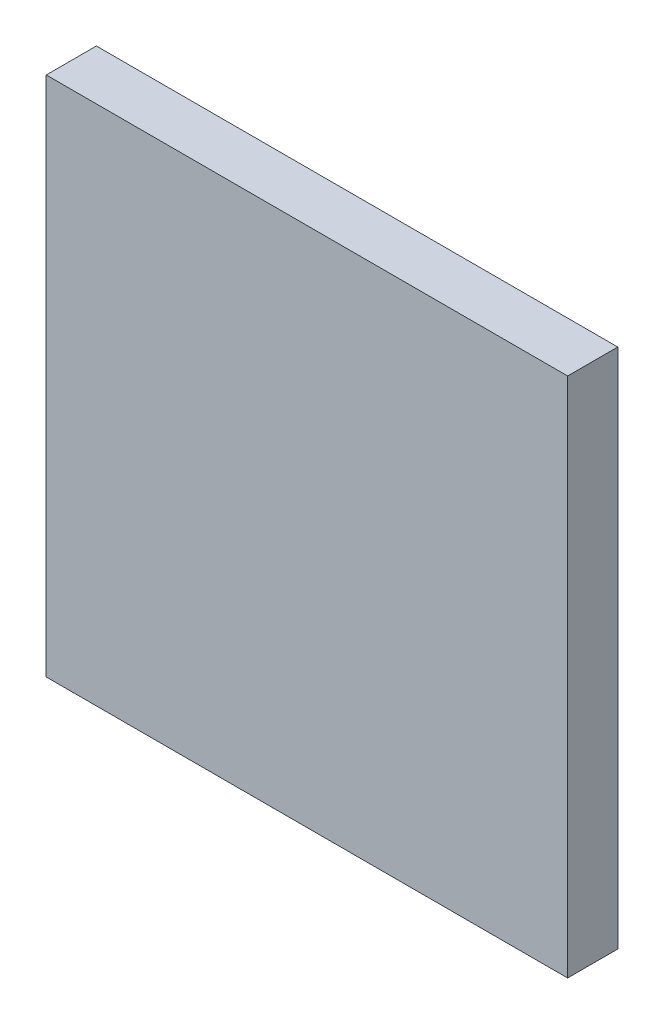
ISO-10303-21;
HEADER;
FILE_DESCRIPTION(('STEP AP214'),'2;1');
FILE_NAME('part.step','',(''),(''),'','','');
FILE_SCHEMA(('AUTOMOTIVE_DESIGN { 1 0 10303 214 1 1 1 1 }'));
ENDSEC;
DATA;
#1=APPLICATION_CONTEXT('core data for automotive mechanical design processes');
#2=APPLICATION_PROTOCOL_DEFINITION('international standard','automotive_design',2000,#1);
#3=PRODUCT_CONTEXT('',#1,'mechanical');
#4=PRODUCT('Part','Part','',(#3));
#5=PRODUCT_RELATED_PRODUCT_CATEGORY('part','',(#4));
#6=PRODUCT_DEFINITION_FORMATION('','',#4);
#7=PRODUCT_DEFINITION_CONTEXT('part definition',#1,'design');
#8=PRODUCT_DEFINITION('design','',#6,#7);
#9=PRODUCT_DEFINITION_SHAPE('','',#8);
#10=(LENGTH_UNIT() NAMED_UNIT(*) SI_UNIT(.MILLI.,.METRE.));
#11=(NAMED_UNIT(*) PLANE_ANGLE_UNIT() SI_UNIT($,.RADIAN.));
#12=(NAMED_UNIT(*) SI_UNIT($,.STERADIAN.) SOLID_ANGLE_UNIT());
#13=UNCERTAINTY_MEASURE_WITH_UNIT(LENGTH_MEASURE(1.E-05),#10,'distance_accuracy_value','');
#14=(GEOMETRIC_REPRESENTATION_CONTEXT(3) GLOBAL_UNCERTAINTY_ASSIGNED_CONTEXT((#13)) GLOBAL_UNIT_ASSIGNED_CONTEXT((#10,
#11,#12)) REPRESENTATION_CONTEXT('',''));
#15=CARTESIAN_POINT('',(0.,0.,0.));
#16=DIRECTION('',(0.,0.,1.));
#17=DIRECTION('',(1.,0.,0.));
#18=AXIS2_PLACEMENT_3D('',#15,#16,#17);
#19=CARTESIAN_POINT('',(13.,-13.,1.25));
#20=DIRECTION('',(-1.,0.,0.));
#21=DIRECTION('',(0.,0.,1.));
#22=AXIS2_PLACEMENT_3D('',#19,#20,#21);
#23=PLANE('',#22);
#24=DIRECTION('',(0.,1.,0.));
#25=VECTOR('',#24,1.);
#26=CARTESIAN_POINT('',(13.,-13.,-1.25));
#27=LINE('',#26,#25);
#28=CARTESIAN_POINT('',(13.,-13.,-1.25));
#29=VERTEX_POINT('',#28);
#30=CARTESIAN_POINT('',(13.,13.,-1.25));
#31=VERTEX_POINT('',#30);
#32=EDGE_CURVE('E102',#29,#31,#27,.T.);
#33=ORIENTED_EDGE('',*,*,#32,.T.);
#34=DIRECTION('',(0.,0.,-1.));
#35=VECTOR('',#34,1.);
#36=CARTESIAN_POINT('',(13.,13.,1.25));
#37=LINE('',#36,#35);
#38=CARTESIAN_POINT('',(13.,13.,1.25));
#39=VERTEX_POINT('',#38);
#40=EDGE_CURVE('E11',#39,#31,#37,.T.);
#41=ORIENTED_EDGE('',*,*,#40,.F.);
#42=DIRECTION('',(0.,1.,0.));
#43=VECTOR('',#42,1.);
#44=CARTESIAN_POINT('',(13.,-13.,1.25));
#45=LINE('',#44,#43);
#46=CARTESIAN_POINT('',(13.,-13.,1.25));
#47=VERTEX_POINT('',#46);
#48=EDGE_CURVE('E90',#47,#39,#45,.T.);
#49=ORIENTED_EDGE('',*,*,#48,.F.);
#50=DIRECTION('',(0.,0.,-1.));
#51=VECTOR('',#50,1.);
#52=CARTESIAN_POINT('',(13.,-13.,1.25));
#53=LINE('',#52,#51);
#54=EDGE_CURVE('E98',#47,#29,#53,.T.);
#55=ORIENTED_EDGE('',*,*,#54,.T.);
#56=EDGE_LOOP('',(#33,#41,#49,#55));
#57=FACE_BOUND('',#56,.T.);
#58=ADVANCED_FACE('F39',(#57),#23,.F.);
#59=CARTESIAN_POINT('',(-13.,13.,1.25));
#60=DIRECTION('',(0.,-1.,0.));
#61=DIRECTION('',(0.,0.,-1.));
#62=AXIS2_PLACEMENT_3D('',#59,#60,#61);
#63=PLANE('',#62);
#64=DIRECTION('',(-1.,0.,0.));
#65=VECTOR('',#64,1.);
#66=CARTESIAN_POINT('',(-13.,13.,-1.25));
#67=LINE('',#66,#65);
#68=CARTESIAN_POINT('',(-13.,13.,-1.25));
#69=VERTEX_POINT('',#68);
#70=EDGE_CURVE('E94',#31,#69,#67,.T.);
#71=ORIENTED_EDGE('',*,*,#70,.T.);
#72=DIRECTION('',(0.,0.,-1.));
#73=VECTOR('',#72,1.);
#74=CARTESIAN_POINT('',(-13.,13.,1.25));
#75=LINE('',#74,#73);
#76=CARTESIAN_POINT('',(-13.,13.,1.25));
#77=VERTEX_POINT('',#76);
#78=EDGE_CURVE('E47',#77,#69,#75,.T.);
#79=ORIENTED_EDGE('',*,*,#78,.F.);
#80=DIRECTION('',(-1.,0.,0.));
#81=VECTOR('',#80,1.);
#82=CARTESIAN_POINT('',(-13.,13.,1.25));
#83=LINE('',#82,#81);
#84=EDGE_CURVE('E85',#39,#77,#83,.T.);
#85=ORIENTED_EDGE('',*,*,#84,.F.);
#86=ORIENTED_EDGE('',*,*,#40,.T.);
#87=EDGE_LOOP('',(#71,#79,#85,#86));
#88=FACE_BOUND('',#87,.T.);
#89=ADVANCED_FACE('F93',(#88),#63,.F.);
#90=CARTESIAN_POINT('',(-13.,-13.,1.25));
#91=DIRECTION('',(1.,0.,0.));
#92=DIRECTION('',(0.,0.,-1.));
#93=AXIS2_PLACEMENT_3D('',#90,#91,#92);
#94=PLANE('',#93);
#95=DIRECTION('',(0.,-1.,0.));
#96=VECTOR('',#95,1.);
#97=CARTESIAN_POINT('',(-13.,-13.,-1.25));
#98=LINE('',#97,#96);
#99=CARTESIAN_POINT('',(-13.,-13.,-1.25));
#100=VERTEX_POINT('',#99);
#101=EDGE_CURVE('E72',#69,#100,#98,.T.);
#102=ORIENTED_EDGE('',*,*,#101,.T.);
#103=DIRECTION('',(0.,0.,-1.));
#104=VECTOR('',#103,1.);
#105=CARTESIAN_POINT('',(-13.,-13.,1.25));
#106=LINE('',#105,#104);
#107=CARTESIAN_POINT('',(-13.,-13.,1.25));
#108=VERTEX_POINT('',#107);
#109=EDGE_CURVE('E95',#108,#100,#106,.T.);
#110=ORIENTED_EDGE('',*,*,#109,.F.);
#111=DIRECTION('',(0.,-1.,0.));
#112=VECTOR('',#111,1.);
#113=CARTESIAN_POINT('',(-13.,-13.,1.25));
#114=LINE('',#113,#112);
#115=EDGE_CURVE('E88',#77,#108,#114,.T.);
#116=ORIENTED_EDGE('',*,*,#115,.F.);
#117=ORIENTED_EDGE('',*,*,#78,.T.);
#118=EDGE_LOOP('',(#102,#110,#116,#117));
#119=FACE_BOUND('',#118,.T.);
#120=ADVANCED_FACE('F96',(#119),#94,.F.);
#121=CARTESIAN_POINT('',(-13.,-13.,1.25));
#122=DIRECTION('',(0.,1.,0.));
#123=DIRECTION('',(0.,0.,1.));
#124=AXIS2_PLACEMENT_3D('',#121,#122,#123);
#125=PLANE('',#124);
#126=DIRECTION('',(1.,0.,0.));
#127=VECTOR('',#126,1.);
#128=CARTESIAN_POINT('',(-13.,-13.,-1.25));
#129=LINE('',#128,#127);
#130=EDGE_CURVE('E78',#100,#29,#129,.T.);
#131=ORIENTED_EDGE('',*,*,#130,.T.);
#132=ORIENTED_EDGE('',*,*,#54,.F.);
#133=DIRECTION('',(1.,0.,0.));
#134=VECTOR('',#133,1.);
#135=CARTESIAN_POINT('',(-13.,-13.,1.25));
#136=LINE('',#135,#134);
#137=EDGE_CURVE('E55',#108,#47,#136,.T.);
#138=ORIENTED_EDGE('',*,*,#137,.F.);
#139=ORIENTED_EDGE('',*,*,#109,.T.);
#140=EDGE_LOOP('',(#131,#132,#138,#139));
#141=FACE_BOUND('',#140,.T.);
#142=ADVANCED_FACE('F109',(#141),#125,.F.);
#143=CARTESIAN_POINT('',(0.,0.,1.25));
#144=DIRECTION('',(0.,0.,-1.));
#145=DIRECTION('',(-1.,0.,0.));
#146=AXIS2_PLACEMENT_3D('',#143,#144,#145);
#147=PLANE('',#146);
#148=ORIENTED_EDGE('',*,*,#48,.T.);
#149=ORIENTED_EDGE('',*,*,#84,.T.);
#150=ORIENTED_EDGE('',*,*,#115,.T.);
#151=ORIENTED_EDGE('',*,*,#137,.T.);
#152=EDGE_LOOP('',(#148,#149,#150,#151));
#153=FACE_BOUND('',#152,.T.);
#154=ADVANCED_FACE('F86',(#153),#147,.F.);
#155=CARTESIAN_POINT('',(0.,0.,-1.25));
#156=DIRECTION('',(0.,0.,-1.));
#157=DIRECTION('',(-1.,0.,0.));
#158=AXIS2_PLACEMENT_3D('',#155,#156,#157);
#159=PLANE('',#158);
#160=ORIENTED_EDGE('',*,*,#32,.F.);
#161=ORIENTED_EDGE('',*,*,#130,.F.);
#162=ORIENTED_EDGE('',*,*,#101,.F.);
#163=ORIENTED_EDGE('',*,*,#70,.F.);
#164=EDGE_LOOP('',(#160,#161,#162,#163));
#165=FACE_BOUND('',#164,.T.);
#166=ADVANCED_FACE('F112',(#165),#159,.T.);
#167=CLOSED_SHELL('',(#58,#89,#120,#142,#154,#166));
#168=MANIFOLD_SOLID_BREP('B2',#167);
#169=ADVANCED_BREP_SHAPE_REPRESENTATION('',(#18,#168),#14);
#170=SHAPE_DEFINITION_REPRESENTATION(#9,#169);
ENDSEC;
END-ISO-10303-21;
